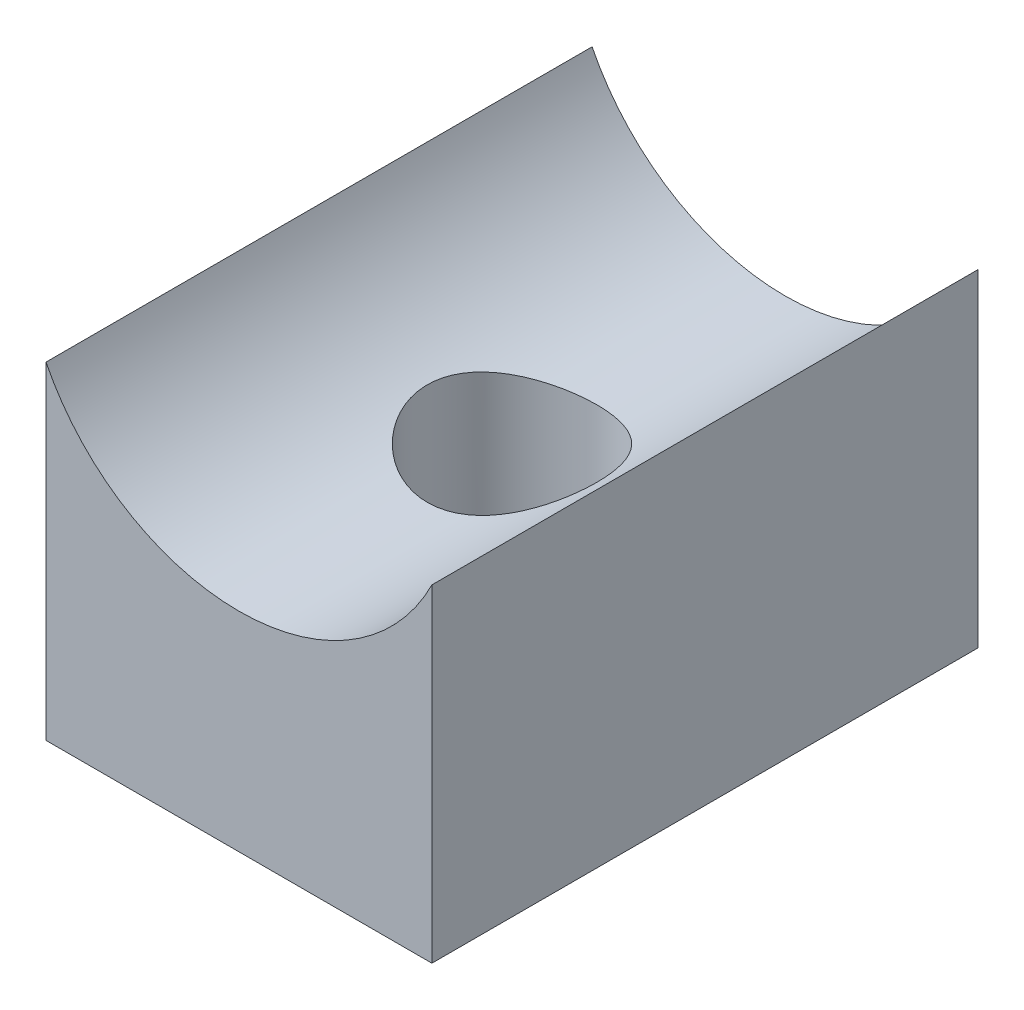
ISO-10303-21;
HEADER;
FILE_DESCRIPTION(('STEP AP214'),'2;1');
FILE_NAME('part.step','',(''),(''),'','','');
FILE_SCHEMA(('AUTOMOTIVE_DESIGN { 1 0 10303 214 1 1 1 1 }'));
ENDSEC;
DATA;
#1=APPLICATION_CONTEXT('core data for automotive mechanical design processes');
#2=APPLICATION_PROTOCOL_DEFINITION('international standard','automotive_design',2000,#1);
#3=PRODUCT_CONTEXT('',#1,'mechanical');
#4=PRODUCT('Part','Part','',(#3));
#5=PRODUCT_RELATED_PRODUCT_CATEGORY('part','',(#4));
#6=PRODUCT_DEFINITION_FORMATION('','',#4);
#7=PRODUCT_DEFINITION_CONTEXT('part definition',#1,'design');
#8=PRODUCT_DEFINITION('design','',#6,#7);
#9=PRODUCT_DEFINITION_SHAPE('','',#8);
#10=(LENGTH_UNIT() NAMED_UNIT(*) SI_UNIT(.MILLI.,.METRE.));
#11=(NAMED_UNIT(*) PLANE_ANGLE_UNIT() SI_UNIT($,.RADIAN.));
#12=(NAMED_UNIT(*) SI_UNIT($,.STERADIAN.) SOLID_ANGLE_UNIT());
#13=UNCERTAINTY_MEASURE_WITH_UNIT(LENGTH_MEASURE(1.E-05),#10,'distance_accuracy_value','');
#14=(GEOMETRIC_REPRESENTATION_CONTEXT(3) GLOBAL_UNCERTAINTY_ASSIGNED_CONTEXT((#13)) GLOBAL_UNIT_ASSIGNED_CONTEXT((#10,
#11,#12)) REPRESENTATION_CONTEXT('',''));
#15=CARTESIAN_POINT('',(0.,0.,0.));
#16=DIRECTION('',(0.,0.,1.));
#17=DIRECTION('',(1.,0.,0.));
#18=AXIS2_PLACEMENT_3D('',#15,#16,#17);
#19=CARTESIAN_POINT('',(-3.5332710579294,0.,5.));
#20=DIRECTION('',(1.,0.,0.));
#21=DIRECTION('',(0.,1.,0.));
#22=AXIS2_PLACEMENT_3D('',#19,#20,#21);
#23=PLANE('',#22);
#24=DIRECTION('',(0.,-1.,0.));
#25=VECTOR('',#24,1.);
#26=CARTESIAN_POINT('',(-3.5332710579294,0.,-5.));
#27=LINE('',#26,#25);
#28=CARTESIAN_POINT('',(-3.5332710579294,0.,-5.));
#29=VERTEX_POINT('',#28);
#30=CARTESIAN_POINT('',(-3.5332710579294,-6.,-5.));
#31=VERTEX_POINT('',#30);
#32=EDGE_CURVE('E98',#29,#31,#27,.T.);
#33=ORIENTED_EDGE('',*,*,#32,.T.);
#34=DIRECTION('',(0.,0.,-1.));
#35=VECTOR('',#34,1.);
#36=CARTESIAN_POINT('',(-3.5332710579294,-6.,5.));
#37=LINE('',#36,#35);
#38=CARTESIAN_POINT('',(-3.5332710579294,-6.,5.));
#39=VERTEX_POINT('',#38);
#40=EDGE_CURVE('E11',#39,#31,#37,.T.);
#41=ORIENTED_EDGE('',*,*,#40,.F.);
#42=DIRECTION('',(0.,-1.,0.));
#43=VECTOR('',#42,1.);
#44=CARTESIAN_POINT('',(-3.5332710579294,0.,5.));
#45=LINE('',#44,#43);
#46=CARTESIAN_POINT('',(-3.5332710579294,0.,5.));
#47=VERTEX_POINT('',#46);
#48=EDGE_CURVE('E86',#47,#39,#45,.T.);
#49=ORIENTED_EDGE('',*,*,#48,.F.);
#50=DIRECTION('',(0.,0.,-1.));
#51=VECTOR('',#50,1.);
#52=CARTESIAN_POINT('',(-3.5332710579294,0.,5.));
#53=LINE('',#52,#51);
#54=EDGE_CURVE('E94',#47,#29,#53,.T.);
#55=ORIENTED_EDGE('',*,*,#54,.T.);
#56=EDGE_LOOP('',(#33,#41,#49,#55));
#57=FACE_BOUND('',#56,.T.);
#58=ADVANCED_FACE('F35',(#57),#23,.F.);
#59=CARTESIAN_POINT('',(-3.5332710579294,-6.,5.));
#60=DIRECTION('',(0.,1.,0.));
#61=DIRECTION('',(0.,0.,1.));
#62=AXIS2_PLACEMENT_3D('',#59,#60,#61);
#63=PLANE('',#62);
#64=CARTESIAN_POINT('',(0.,-6.,0.));
#65=DIRECTION('',(0.,-1.,0.));
#66=DIRECTION('',(0.,0.,-1.));
#67=AXIS2_PLACEMENT_3D('',#64,#65,#66);
#68=CIRCLE('',#67,1.55);
#69=CARTESIAN_POINT('',(0.,-6.,-1.55));
#70=VERTEX_POINT('',#69);
#71=EDGE_CURVE('E119',#70,#70,#68,.T.);
#72=ORIENTED_EDGE('',*,*,#71,.F.);
#73=EDGE_LOOP('',(#72));
#74=FACE_BOUND('',#73,.T.);
#75=DIRECTION('',(1.,0.,0.));
#76=VECTOR('',#75,1.);
#77=CARTESIAN_POINT('',(-3.5332710579294,-6.,-5.));
#78=LINE('',#77,#76);
#79=CARTESIAN_POINT('',(3.5332710579294,-6.,-5.));
#80=VERTEX_POINT('',#79);
#81=EDGE_CURVE('E90',#31,#80,#78,.T.);
#82=ORIENTED_EDGE('',*,*,#81,.T.);
#83=DIRECTION('',(0.,0.,-1.));
#84=VECTOR('',#83,1.);
#85=CARTESIAN_POINT('',(3.5332710579294,-6.,5.));
#86=LINE('',#85,#84);
#87=CARTESIAN_POINT('',(3.5332710579294,-6.,5.));
#88=VERTEX_POINT('',#87);
#89=EDGE_CURVE('E43',#88,#80,#86,.T.);
#90=ORIENTED_EDGE('',*,*,#89,.F.);
#91=DIRECTION('',(1.,0.,0.));
#92=VECTOR('',#91,1.);
#93=CARTESIAN_POINT('',(-3.5332710579294,-6.,5.));
#94=LINE('',#93,#92);
#95=EDGE_CURVE('E81',#39,#88,#94,.T.);
#96=ORIENTED_EDGE('',*,*,#95,.F.);
#97=ORIENTED_EDGE('',*,*,#40,.T.);
#98=EDGE_LOOP('',(#82,#90,#96,#97));
#99=FACE_BOUND('',#98,.T.);
#100=ADVANCED_FACE('F89',(#74,#99),#63,.F.);
#101=CARTESIAN_POINT('',(3.5332710579294,0.,5.));
#102=DIRECTION('',(-1.,0.,0.));
#103=DIRECTION('',(0.,-1.,0.));
#104=AXIS2_PLACEMENT_3D('',#101,#102,#103);
#105=PLANE('',#104);
#106=DIRECTION('',(0.,1.,0.));
#107=VECTOR('',#106,1.);
#108=CARTESIAN_POINT('',(3.5332710579294,0.,-5.));
#109=LINE('',#108,#107);
#110=CARTESIAN_POINT('',(3.5332710579294,0.,-5.));
#111=VERTEX_POINT('',#110);
#112=EDGE_CURVE('E68',#80,#111,#109,.T.);
#113=ORIENTED_EDGE('',*,*,#112,.T.);
#114=DIRECTION('',(0.,0.,-1.));
#115=VECTOR('',#114,1.);
#116=CARTESIAN_POINT('',(3.5332710579294,0.,5.));
#117=LINE('',#116,#115);
#118=CARTESIAN_POINT('',(3.5332710579294,0.,5.));
#119=VERTEX_POINT('',#118);
#120=EDGE_CURVE('E91',#119,#111,#117,.T.);
#121=ORIENTED_EDGE('',*,*,#120,.F.);
#122=DIRECTION('',(0.,1.,0.));
#123=VECTOR('',#122,1.);
#124=CARTESIAN_POINT('',(3.5332710579294,0.,5.));
#125=LINE('',#124,#123);
#126=EDGE_CURVE('E84',#88,#119,#125,.T.);
#127=ORIENTED_EDGE('',*,*,#126,.F.);
#128=ORIENTED_EDGE('',*,*,#89,.T.);
#129=EDGE_LOOP('',(#113,#121,#127,#128));
#130=FACE_BOUND('',#129,.T.);
#131=ADVANCED_FACE('F92',(#130),#105,.F.);
#132=CARTESIAN_POINT('',(0.,1.76592628136015,5.));
#133=DIRECTION('',(0.,0.,-1.));
#134=DIRECTION('',(-1.,0.,0.));
#135=AXIS2_PLACEMENT_3D('',#132,#133,#134);
#136=CYLINDRICAL_SURFACE('',#135,3.95);
#137=CARTESIAN_POINT('',(0.,-2.18407371863985,-1.55));
#138=CARTESIAN_POINT('',(-0.0836614400636267,-2.1840771456206,-1.55000443855606));
#139=CARTESIAN_POINT('',(-0.167294034768696,-2.18139332734036,-1.54320587471294));
#140=CARTESIAN_POINT('',(-0.332044827439647,-2.17095734828892,-1.51631381027645));
#141=CARTESIAN_POINT('',(-0.413163636116058,-2.16320642881474,-1.49622356575588));
#142=CARTESIAN_POINT('',(-0.570485530289343,-2.14346346514239,-1.44357818341303));
#143=CARTESIAN_POINT('',(-0.646698275758918,-2.13148007665693,-1.41104847407289));
#144=CARTESIAN_POINT('',(-0.792574541659347,-2.10445300148073,-1.33458328558985));
#145=CARTESIAN_POINT('',(-0.862236136618689,-2.0894084191487,-1.29064446733905));
#146=CARTESIAN_POINT('',(-0.996227021114462,-2.05702806924085,-1.19050973950249));
#147=CARTESIAN_POINT('',(-1.06021701456242,-2.03962331340058,-1.13388236292623));
#148=CARTESIAN_POINT('',(-1.17807126389012,-2.00480722237163,-1.01089398553686));
#149=CARTESIAN_POINT('',(-1.23193197798645,-1.98739588700672,-0.944529594484223));
#150=CARTESIAN_POINT('',(-1.3302599087781,-1.9537146777295,-0.800516421089274));
#151=CARTESIAN_POINT('',(-1.37423029266103,-1.93752482580846,-0.722507792275607));
#152=CARTESIAN_POINT('',(-1.44827466868447,-1.90920416483343,-0.559469489477734));
#153=CARTESIAN_POINT('',(-1.47835481291966,-1.89707155945155,-0.47444294349066));
#154=CARTESIAN_POINT('',(-1.52239647600919,-1.87898202716448,-0.303700768071053));
#155=CARTESIAN_POINT('',(-1.53700970796362,-1.87277658281552,-0.218180512037063));
#156=CARTESIAN_POINT('',(-1.55173929167652,-1.86652135565887,-0.0456937465839786));
#157=CARTESIAN_POINT('',(-1.55186238539484,-1.866468710082,0.0412720714068683));
#158=CARTESIAN_POINT('',(-1.53810333879321,-1.87231236395019,0.208014781968463));
#159=CARTESIAN_POINT('',(-1.52515239268658,-1.87781312549305,0.287885031223945));
#160=CARTESIAN_POINT('',(-1.48716147563656,-1.89348193284332,0.444211382888959));
#161=CARTESIAN_POINT('',(-1.46211950252292,-1.9036507516272,0.520666917559507));
#162=CARTESIAN_POINT('',(-1.40018736902345,-1.92772963921548,0.669796035647439));
#163=CARTESIAN_POINT('',(-1.36307050539472,-1.94171039056776,0.742363551473128));
#164=CARTESIAN_POINT('',(-1.27820094626255,-1.97181716567539,0.880499696734214));
#165=CARTESIAN_POINT('',(-1.23044434500918,-1.98794397635171,0.946065742885748));
#166=CARTESIAN_POINT('',(-1.12148663039464,-2.02198285305753,1.07345308141841));
#167=CARTESIAN_POINT('',(-1.05955121029249,-2.0399386295903,1.1346362616234));
#168=CARTESIAN_POINT('',(-0.926102705512948,-2.07459217010978,1.24594739096094));
#169=CARTESIAN_POINT('',(-0.854587860135047,-2.09128970194716,1.29607330327163));
#170=CARTESIAN_POINT('',(-0.70225731098852,-2.12193583586117,1.38464218115282));
#171=CARTESIAN_POINT('',(-0.621294897872926,-2.1358283125772,1.42285364452256));
#172=CARTESIAN_POINT('',(-0.453408364358114,-2.1588773028594,1.48489684467067));
#173=CARTESIAN_POINT('',(-0.36648717705667,-2.16803612778812,1.50873560034924));
#174=CARTESIAN_POINT('',(-0.194506038206237,-2.18016918594174,1.54008598032453));
#175=CARTESIAN_POINT('',(-0.109625304209057,-2.18346802856661,1.54845568290351));
#176=CARTESIAN_POINT('',(0.0603832056245411,-2.18452594005902,1.55115319852688));
#177=CARTESIAN_POINT('',(0.14551091516376,-2.18228637895376,1.54548448423437));
#178=CARTESIAN_POINT('',(0.309763962099394,-2.17273222874977,1.52090387153162));
#179=CARTESIAN_POINT('',(0.388990148737968,-2.16563940972929,1.50257035514601));
#180=CARTESIAN_POINT('',(0.543174210490915,-2.14731966386501,1.45395963931282));
#181=CARTESIAN_POINT('',(0.618131532892181,-2.13609220308537,1.42368089725685));
#182=CARTESIAN_POINT('',(0.764200622917377,-2.11017602021516,1.35105581799947));
#183=CARTESIAN_POINT('',(0.835127219261876,-2.09539278497323,1.3083718345613));
#184=CARTESIAN_POINT('',(0.969057246980869,-2.06397811921633,1.21252451713632));
#185=CARTESIAN_POINT('',(1.03205755729479,-2.04734596549503,1.15935707619835));
#186=CARTESIAN_POINT('',(1.15254399996072,-2.01274004106951,1.04008446289465));
#187=CARTESIAN_POINT('',(1.20942508522207,-1.99474819199705,0.973371734004265));
#188=CARTESIAN_POINT('',(1.31132447458552,-1.96044283139459,0.831017818383135));
#189=CARTESIAN_POINT('',(1.3563411215843,-1.94412955450414,0.755375386576879));
#190=CARTESIAN_POINT('',(1.43343852461058,-1.91503471188319,0.5963383129104));
#191=CARTESIAN_POINT('',(1.4654150214378,-1.90228185825221,0.512887507111347));
#192=CARTESIAN_POINT('',(1.51462544913887,-1.88224164742264,0.341137557295655));
#193=CARTESIAN_POINT('',(1.53186970695143,-1.87495046217069,0.252841855712851));
#194=CARTESIAN_POINT('',(1.55015882353298,-1.86719869223641,0.0805328403947474));
#195=CARTESIAN_POINT('',(1.55224802059662,-1.86629785134138,-0.00335058024950722));
#196=CARTESIAN_POINT('',(1.54288954244154,-1.87028294299102,-0.170210551331941));
#197=CARTESIAN_POINT('',(1.53144342459501,-1.87516820978674,-0.253187204994079));
#198=CARTESIAN_POINT('',(1.49618028396337,-1.88979332120403,-0.412773375542154));
#199=CARTESIAN_POINT('',(1.47283160762422,-1.89934885003183,-0.489504782697085));
#200=CARTESIAN_POINT('',(1.41485634370557,-1.92211473001139,-0.637996125463391));
#201=CARTESIAN_POINT('',(1.38022678681163,-1.93532604328812,-0.709754746117632));
#202=CARTESIAN_POINT('',(1.29843545518199,-1.96483145238141,-0.850626044738553));
#203=CARTESIAN_POINT('',(1.25068194446186,-1.98125648083974,-0.919367326186587));
#204=CARTESIAN_POINT('',(1.14487854166492,-2.0149245612913,-1.04819206567507));
#205=CARTESIAN_POINT('',(1.08682522558526,-2.03216788391244,-1.1082726325262));
#206=CARTESIAN_POINT('',(0.957812958923275,-2.0668031913192,-1.22185189954717));
#207=CARTESIAN_POINT('',(0.886280005558722,-2.08413914184937,-1.27471886976637));
#208=CARTESIAN_POINT('',(0.734730995873002,-2.11591125220504,-1.36768975379235));
#209=CARTESIAN_POINT('',(0.654712868407854,-2.13034670154731,-1.4077905419011));
#210=CARTESIAN_POINT('',(0.481348140550785,-2.15569119706167,-1.47654985315531));
#211=CARTESIAN_POINT('',(0.387446521546018,-2.16620476786883,-1.50397221445951));
#212=CARTESIAN_POINT('',(0.195681748032059,-2.18039184790964,-1.54068892260096));
#213=CARTESIAN_POINT('',(0.0978211561070746,-2.1840697116419,-1.54999481021741));
#214=CARTESIAN_POINT('',(0.,-2.18407371863985,-1.55));
#215=B_SPLINE_CURVE_WITH_KNOTS('',3,(#137,#138,#139,#140,#141,#142,#143,#144,#145,#146,#147,
#148,#149,#150,#151,#152,#153,#154,#155,#156,#157,#158,#159,#160,#161,#162,#163,#164,#165,#166,
#167,#168,#169,#170,#171,#172,#173,#174,#175,#176,#177,#178,#179,#180,#181,#182,#183,#184,#185,
#186,#187,#188,#189,#190,#191,#192,#193,#194,#195,#196,#197,#198,#199,#200,#201,#202,#203,#204,
#205,#206,#207,#208,#209,#210,#211,#212,#213,#214),.UNSPECIFIED.,.T.,.F.,(4,2,2,2,2,2,2,2,2,2,2,
2,2,2,2,2,2,2,2,2,2,2,2,2,2,2,2,2,2,2,2,2,2,2,2,2,2,2,4),(0.,0.250623197341936,
0.501185022056453,0.751237368322739,1.00136298014594,1.26182443711984,1.52237679788141,
1.79400866175857,2.06552010211437,2.32507034995185,2.58449983398132,2.8266700153121,
3.06888031170588,3.31592937201711,3.56306927163616,3.82853353001694,4.09404664791022,
4.36443667508358,4.63469455032547,4.88945068088205,5.14414379907422,5.38791398346312,
5.63171565868355,5.8828996815129,6.13418230325221,6.40143742674379,6.66872985793802,
6.93811932815558,7.20731980764906,7.45777624579795,7.7082038692539,7.9494613187857,
8.19078232265095,8.44557633961768,8.7004552179651,8.9710037730996,9.24161851903814,
9.53484660136126,9.82788782671663),.UNSPECIFIED.);
#216=CARTESIAN_POINT('',(0.,-2.18407371863985,-1.55));
#217=VERTEX_POINT('',#216);
#218=EDGE_CURVE('E101',#217,#217,#215,.T.);
#219=ORIENTED_EDGE('',*,*,#218,.F.);
#220=EDGE_LOOP('',(#219));
#221=FACE_BOUND('',#220,.T.);
#222=CARTESIAN_POINT('',(0.,1.76592628136015,-5.));
#223=DIRECTION('',(0.,0.,-1.));
#224=DIRECTION('',(1.,0.,0.));
#225=AXIS2_PLACEMENT_3D('',#222,#223,#224);
#226=CIRCLE('',#225,3.95);
#227=EDGE_CURVE('E74',#111,#29,#226,.T.);
#228=ORIENTED_EDGE('',*,*,#227,.T.);
#229=ORIENTED_EDGE('',*,*,#54,.F.);
#230=CARTESIAN_POINT('',(0.,1.76592628136015,5.));
#231=DIRECTION('',(0.,0.,-1.));
#232=DIRECTION('',(1.,0.,0.));
#233=AXIS2_PLACEMENT_3D('',#230,#231,#232);
#234=CIRCLE('',#233,3.95);
#235=EDGE_CURVE('E51',#119,#47,#234,.T.);
#236=ORIENTED_EDGE('',*,*,#235,.F.);
#237=ORIENTED_EDGE('',*,*,#120,.T.);
#238=EDGE_LOOP('',(#228,#229,#236,#237));
#239=FACE_BOUND('',#238,.T.);
#240=ADVANCED_FACE('F106',(#221,#239),#136,.F.);
#241=CARTESIAN_POINT('',(0.,1.76592628136015,5.));
#242=DIRECTION('',(0.,0.,1.));
#243=DIRECTION('',(1.,0.,0.));
#244=AXIS2_PLACEMENT_3D('',#241,#242,#243);
#245=PLANE('',#244);
#246=ORIENTED_EDGE('',*,*,#48,.T.);
#247=ORIENTED_EDGE('',*,*,#95,.T.);
#248=ORIENTED_EDGE('',*,*,#126,.T.);
#249=ORIENTED_EDGE('',*,*,#235,.T.);
#250=EDGE_LOOP('',(#246,#247,#248,#249));
#251=FACE_BOUND('',#250,.T.);
#252=ADVANCED_FACE('F82',(#251),#245,.T.);
#253=CARTESIAN_POINT('',(0.,1.76592628136015,-5.));
#254=DIRECTION('',(0.,0.,1.));
#255=DIRECTION('',(1.,0.,0.));
#256=AXIS2_PLACEMENT_3D('',#253,#254,#255);
#257=PLANE('',#256);
#258=ORIENTED_EDGE('',*,*,#32,.F.);
#259=ORIENTED_EDGE('',*,*,#227,.F.);
#260=ORIENTED_EDGE('',*,*,#112,.F.);
#261=ORIENTED_EDGE('',*,*,#81,.F.);
#262=EDGE_LOOP('',(#258,#259,#260,#261));
#263=FACE_BOUND('',#262,.T.);
#264=ADVANCED_FACE('F109',(#263),#257,.F.);
#265=CARTESIAN_POINT('',(0.,0.00100000000000013,0.));
#266=DIRECTION('',(0.,-1.,0.));
#267=DIRECTION('',(0.,0.,-1.));
#268=AXIS2_PLACEMENT_3D('',#265,#266,#267);
#269=CYLINDRICAL_SURFACE('',#268,1.55);
#270=ORIENTED_EDGE('',*,*,#218,.T.);
#271=EDGE_LOOP('',(#270));
#272=FACE_BOUND('',#271,.T.);
#273=ORIENTED_EDGE('',*,*,#71,.T.);
#274=EDGE_LOOP('',(#273));
#275=FACE_BOUND('',#274,.T.);
#276=ADVANCED_FACE('F120',(#272,#275),#269,.F.);
#277=CLOSED_SHELL('',(#58,#100,#131,#240,#252,#264,#276));
#278=MANIFOLD_SOLID_BREP('B2',#277);
#279=ADVANCED_BREP_SHAPE_REPRESENTATION('',(#18,#278),#14);
#280=SHAPE_DEFINITION_REPRESENTATION(#9,#279);
ENDSEC;
END-ISO-10303-21;
